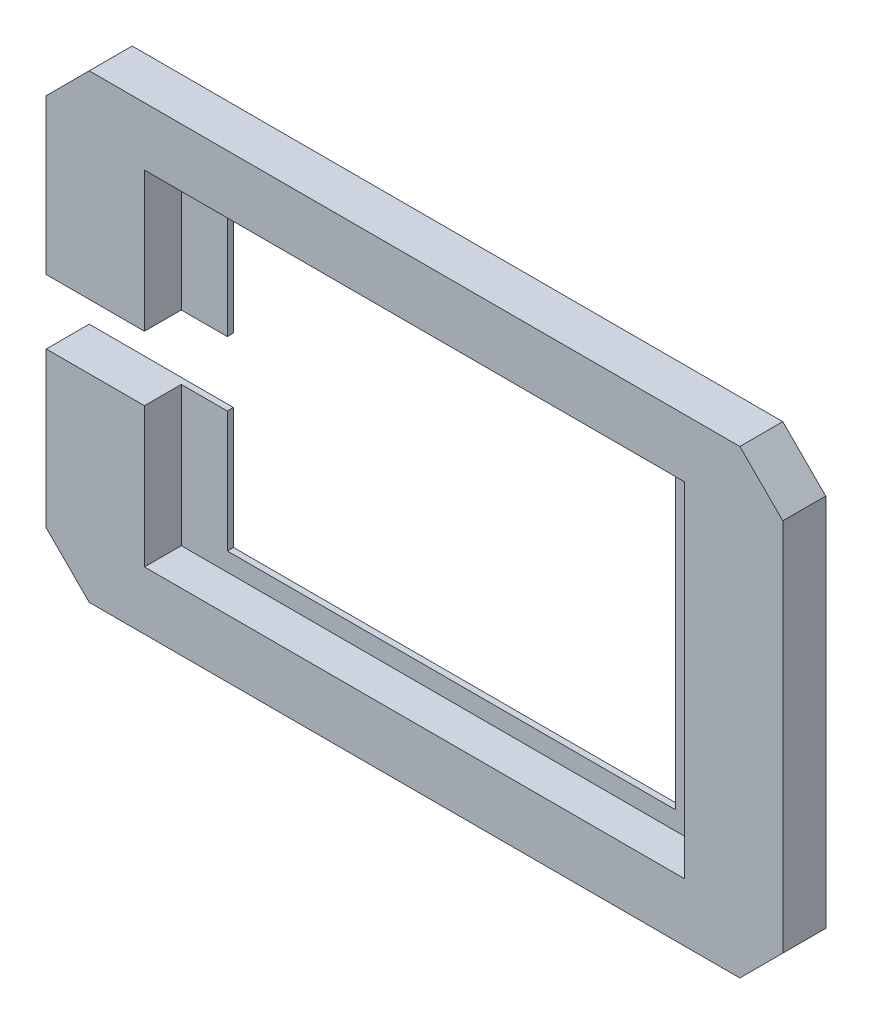
ISO-10303-21;
HEADER;
FILE_DESCRIPTION(('STEP AP214'),'2;1');
FILE_NAME('part.step','',(''),(''),'','','');
FILE_SCHEMA(('AUTOMOTIVE_DESIGN { 1 0 10303 214 1 1 1 1 }'));
ENDSEC;
DATA;
#1=APPLICATION_CONTEXT('core data for automotive mechanical design processes');
#2=APPLICATION_PROTOCOL_DEFINITION('international standard','automotive_design',2000,#1);
#3=PRODUCT_CONTEXT('',#1,'mechanical');
#4=PRODUCT('Part','Part','',(#3));
#5=PRODUCT_RELATED_PRODUCT_CATEGORY('part','',(#4));
#6=PRODUCT_DEFINITION_FORMATION('','',#4);
#7=PRODUCT_DEFINITION_CONTEXT('part definition',#1,'design');
#8=PRODUCT_DEFINITION('design','',#6,#7);
#9=PRODUCT_DEFINITION_SHAPE('','',#8);
#10=(LENGTH_UNIT() NAMED_UNIT(*) SI_UNIT(.MILLI.,.METRE.));
#11=(NAMED_UNIT(*) PLANE_ANGLE_UNIT() SI_UNIT($,.RADIAN.));
#12=(NAMED_UNIT(*) SI_UNIT($,.STERADIAN.) SOLID_ANGLE_UNIT());
#13=UNCERTAINTY_MEASURE_WITH_UNIT(LENGTH_MEASURE(1.E-05),#10,'distance_accuracy_value','');
#14=(GEOMETRIC_REPRESENTATION_CONTEXT(3) GLOBAL_UNCERTAINTY_ASSIGNED_CONTEXT((#13)) GLOBAL_UNIT_ASSIGNED_CONTEXT((#10,
#11,#12)) REPRESENTATION_CONTEXT('',''));
#15=CARTESIAN_POINT('',(0.,0.,0.));
#16=DIRECTION('',(0.,0.,1.));
#17=DIRECTION('',(1.,0.,0.));
#18=AXIS2_PLACEMENT_3D('',#15,#16,#17);
#19=CARTESIAN_POINT('',(-36.5,-25.,15.));
#20=DIRECTION('',(-1.,0.,0.));
#21=DIRECTION('',(0.,0.,1.));
#22=AXIS2_PLACEMENT_3D('',#19,#20,#21);
#23=PLANE('',#22);
#24=DIRECTION('',(0.,1.,0.));
#25=VECTOR('',#24,1.);
#26=CARTESIAN_POINT('',(-36.5,-25.,0.));
#27=LINE('',#26,#25);
#28=CARTESIAN_POINT('',(-36.5,-25.,0.));
#29=VERTEX_POINT('',#28);
#30=CARTESIAN_POINT('',(-36.5,-5.25,0.));
#31=VERTEX_POINT('',#30);
#32=EDGE_CURVE('E270',#29,#31,#27,.T.);
#33=ORIENTED_EDGE('',*,*,#32,.T.);
#34=DIRECTION('',(0.,0.,-1.));
#35=VECTOR('',#34,1.);
#36=CARTESIAN_POINT('',(-36.5,-5.25,25.));
#37=LINE('',#36,#35);
#38=CARTESIAN_POINT('',(-36.5,-5.25,1.));
#39=VERTEX_POINT('',#38);
#40=EDGE_CURVE('E218',#39,#31,#37,.T.);
#41=ORIENTED_EDGE('',*,*,#40,.F.);
#42=DIRECTION('',(0.,1.,0.));
#43=VECTOR('',#42,1.);
#44=CARTESIAN_POINT('',(-36.5,-25.,1.));
#45=LINE('',#44,#43);
#46=CARTESIAN_POINT('',(-36.5,-25.,1.));
#47=VERTEX_POINT('',#46);
#48=EDGE_CURVE('E267',#47,#39,#45,.T.);
#49=ORIENTED_EDGE('',*,*,#48,.F.);
#50=DIRECTION('',(0.,0.,-1.));
#51=VECTOR('',#50,1.);
#52=CARTESIAN_POINT('',(-36.5,-25.,15.));
#53=LINE('',#52,#51);
#54=EDGE_CURVE('E283',#47,#29,#53,.T.);
#55=ORIENTED_EDGE('',*,*,#54,.T.);
#56=EDGE_LOOP('',(#33,#41,#49,#55));
#57=FACE_BOUND('',#56,.T.);
#58=ADVANCED_FACE('F33',(#57),#23,.F.);
#59=CARTESIAN_POINT('',(-60.,-37.5,7.));
#60=DIRECTION('',(1.,0.,0.));
#61=DIRECTION('',(0.,0.,-1.));
#62=AXIS2_PLACEMENT_3D('',#59,#60,#61);
#63=PLANE('',#62);
#64=DIRECTION('',(0.,-1.,0.));
#65=VECTOR('',#64,1.);
#66=CARTESIAN_POINT('',(-60.,-37.5,0.));
#67=LINE('',#66,#65);
#68=CARTESIAN_POINT('',(-60.,-5.25,0.));
#69=VERTEX_POINT('',#68);
#70=CARTESIAN_POINT('',(-60.,-30.5,0.));
#71=VERTEX_POINT('',#70);
#72=EDGE_CURVE('E194',#69,#71,#67,.T.);
#73=ORIENTED_EDGE('',*,*,#72,.T.);
#74=DIRECTION('',(0.,0.,1.));
#75=VECTOR('',#74,1.);
#76=CARTESIAN_POINT('',(-60.,-30.5,7.));
#77=LINE('',#76,#75);
#78=CARTESIAN_POINT('',(-60.,-30.5,7.));
#79=VERTEX_POINT('',#78);
#80=EDGE_CURVE('E330',#71,#79,#77,.T.);
#81=ORIENTED_EDGE('',*,*,#80,.T.);
#82=DIRECTION('',(0.,-1.,0.));
#83=VECTOR('',#82,1.);
#84=CARTESIAN_POINT('',(-60.,-37.5,7.));
#85=LINE('',#84,#83);
#86=CARTESIAN_POINT('',(-60.,-5.25,7.));
#87=VERTEX_POINT('',#86);
#88=EDGE_CURVE('E294',#87,#79,#85,.T.);
#89=ORIENTED_EDGE('',*,*,#88,.F.);
#90=DIRECTION('',(0.,0.,-1.));
#91=VECTOR('',#90,1.);
#92=CARTESIAN_POINT('',(-60.,-5.25,25.));
#93=LINE('',#92,#91);
#94=EDGE_CURVE('E214',#87,#69,#93,.T.);
#95=ORIENTED_EDGE('',*,*,#94,.T.);
#96=EDGE_LOOP('',(#73,#81,#89,#95));
#97=FACE_BOUND('',#96,.T.);
#98=ADVANCED_FACE('F372',(#97),#63,.F.);
#99=CARTESIAN_POINT('',(-44.,-28.,1.));
#100=DIRECTION('',(-1.,0.,0.));
#101=DIRECTION('',(0.,0.,1.));
#102=AXIS2_PLACEMENT_3D('',#99,#100,#101);
#103=PLANE('',#102);
#104=DIRECTION('',(0.,-1.,0.));
#105=VECTOR('',#104,1.);
#106=CARTESIAN_POINT('',(-44.,-28.,1.));
#107=LINE('',#106,#105);
#108=CARTESIAN_POINT('',(-44.,-5.25,1.));
#109=VERTEX_POINT('',#108);
#110=CARTESIAN_POINT('',(-44.,-28.,1.));
#111=VERTEX_POINT('',#110);
#112=EDGE_CURVE('E232',#109,#111,#107,.T.);
#113=ORIENTED_EDGE('',*,*,#112,.F.);
#114=DIRECTION('',(0.,0.,1.));
#115=VECTOR('',#114,1.);
#116=CARTESIAN_POINT('',(-44.,-5.25,1.));
#117=LINE('',#116,#115);
#118=CARTESIAN_POINT('',(-44.,-5.25000000000001,7.));
#119=VERTEX_POINT('',#118);
#120=EDGE_CURVE('E314',#109,#119,#117,.T.);
#121=ORIENTED_EDGE('',*,*,#120,.T.);
#122=DIRECTION('',(0.,-1.,0.));
#123=VECTOR('',#122,1.);
#124=CARTESIAN_POINT('',(-44.,-28.,7.));
#125=LINE('',#124,#123);
#126=CARTESIAN_POINT('',(-44.,-28.,7.));
#127=VERTEX_POINT('',#126);
#128=EDGE_CURVE('E227',#119,#127,#125,.T.);
#129=ORIENTED_EDGE('',*,*,#128,.T.);
#130=DIRECTION('',(0.,0.,1.));
#131=VECTOR('',#130,1.);
#132=CARTESIAN_POINT('',(-44.,-28.,1.));
#133=LINE('',#132,#131);
#134=EDGE_CURVE('E241',#111,#127,#133,.T.);
#135=ORIENTED_EDGE('',*,*,#134,.F.);
#136=EDGE_LOOP('',(#113,#121,#129,#135));
#137=FACE_BOUND('',#136,.T.);
#138=ADVANCED_FACE('F379',(#137),#103,.F.);
#139=CARTESIAN_POINT('',(-36.5,5.25,1.));
#140=VERTEX_POINT('',#139);
#141=CARTESIAN_POINT('',(-36.5,25.,1.));
#142=VERTEX_POINT('',#141);
#143=EDGE_CURVE('E266',#140,#142,#45,.T.);
#144=ORIENTED_EDGE('',*,*,#143,.F.);
#145=DIRECTION('',(0.,0.,-1.));
#146=VECTOR('',#145,1.);
#147=CARTESIAN_POINT('',(-36.5,5.25,25.));
#148=LINE('',#147,#146);
#149=CARTESIAN_POINT('',(-36.5,5.25,0.));
#150=VERTEX_POINT('',#149);
#151=EDGE_CURVE('E203',#140,#150,#148,.T.);
#152=ORIENTED_EDGE('',*,*,#151,.T.);
#153=CARTESIAN_POINT('',(-36.5,25.,0.));
#154=VERTEX_POINT('',#153);
#155=EDGE_CURVE('E210',#150,#154,#27,.T.);
#156=ORIENTED_EDGE('',*,*,#155,.T.);
#157=DIRECTION('',(0.,0.,-1.));
#158=VECTOR('',#157,1.);
#159=CARTESIAN_POINT('',(-36.5,25.,15.));
#160=LINE('',#159,#158);
#161=EDGE_CURVE('E282',#142,#154,#160,.T.);
#162=ORIENTED_EDGE('',*,*,#161,.F.);
#163=EDGE_LOOP('',(#144,#152,#156,#162));
#164=FACE_BOUND('',#163,.T.);
#165=ADVANCED_FACE('F375',(#164),#23,.F.);
#166=CARTESIAN_POINT('',(36.5,-25.,15.));
#167=DIRECTION('',(0.,-1.,0.));
#168=DIRECTION('',(0.,0.,-1.));
#169=AXIS2_PLACEMENT_3D('',#166,#167,#168);
#170=PLANE('',#169);
#171=DIRECTION('',(-1.,0.,0.));
#172=VECTOR('',#171,1.);
#173=CARTESIAN_POINT('',(36.5,-25.,1.));
#174=LINE('',#173,#172);
#175=CARTESIAN_POINT('',(36.5,-25.,1.));
#176=VERTEX_POINT('',#175);
#177=EDGE_CURVE('E264',#176,#47,#174,.T.);
#178=ORIENTED_EDGE('',*,*,#177,.F.);
#179=DIRECTION('',(0.,0.,-1.));
#180=VECTOR('',#179,1.);
#181=CARTESIAN_POINT('',(36.5,-25.,15.));
#182=LINE('',#181,#180);
#183=CARTESIAN_POINT('',(36.5,-25.,0.));
#184=VERTEX_POINT('',#183);
#185=EDGE_CURVE('E285',#176,#184,#182,.T.);
#186=ORIENTED_EDGE('',*,*,#185,.T.);
#187=DIRECTION('',(-1.,0.,0.));
#188=VECTOR('',#187,1.);
#189=CARTESIAN_POINT('',(36.5,-25.,0.));
#190=LINE('',#189,#188);
#191=EDGE_CURVE('E279',#184,#29,#190,.T.);
#192=ORIENTED_EDGE('',*,*,#191,.T.);
#193=ORIENTED_EDGE('',*,*,#54,.F.);
#194=EDGE_LOOP('',(#178,#186,#192,#193));
#195=FACE_BOUND('',#194,.T.);
#196=ADVANCED_FACE('F385',(#195),#170,.F.);
#197=CARTESIAN_POINT('',(36.5,-25.,15.));
#198=DIRECTION('',(1.,0.,0.));
#199=DIRECTION('',(0.,0.,-1.));
#200=AXIS2_PLACEMENT_3D('',#197,#198,#199);
#201=PLANE('',#200);
#202=DIRECTION('',(0.,-1.,0.));
#203=VECTOR('',#202,1.);
#204=CARTESIAN_POINT('',(36.5,-25.,1.));
#205=LINE('',#204,#203);
#206=CARTESIAN_POINT('',(36.5,25.,1.));
#207=VERTEX_POINT('',#206);
#208=EDGE_CURVE('E256',#207,#176,#205,.T.);
#209=ORIENTED_EDGE('',*,*,#208,.F.);
#210=DIRECTION('',(0.,0.,-1.));
#211=VECTOR('',#210,1.);
#212=CARTESIAN_POINT('',(36.5,25.,15.));
#213=LINE('',#212,#211);
#214=CARTESIAN_POINT('',(36.5,25.,0.));
#215=VERTEX_POINT('',#214);
#216=EDGE_CURVE('E287',#207,#215,#213,.T.);
#217=ORIENTED_EDGE('',*,*,#216,.T.);
#218=DIRECTION('',(0.,-1.,0.));
#219=VECTOR('',#218,1.);
#220=CARTESIAN_POINT('',(36.5,-25.,0.));
#221=LINE('',#220,#219);
#222=EDGE_CURVE('E276',#215,#184,#221,.T.);
#223=ORIENTED_EDGE('',*,*,#222,.T.);
#224=ORIENTED_EDGE('',*,*,#185,.F.);
#225=EDGE_LOOP('',(#209,#217,#223,#224));
#226=FACE_BOUND('',#225,.T.);
#227=ADVANCED_FACE('F391',(#226),#201,.F.);
#228=CARTESIAN_POINT('',(36.5,25.,15.));
#229=DIRECTION('',(0.,1.,0.));
#230=DIRECTION('',(0.,0.,1.));
#231=AXIS2_PLACEMENT_3D('',#228,#229,#230);
#232=PLANE('',#231);
#233=DIRECTION('',(1.,0.,0.));
#234=VECTOR('',#233,1.);
#235=CARTESIAN_POINT('',(36.5,25.,1.));
#236=LINE('',#235,#234);
#237=EDGE_CURVE('E301',#142,#207,#236,.T.);
#238=ORIENTED_EDGE('',*,*,#237,.F.);
#239=ORIENTED_EDGE('',*,*,#161,.T.);
#240=DIRECTION('',(1.,0.,0.));
#241=VECTOR('',#240,1.);
#242=CARTESIAN_POINT('',(36.5,25.,0.));
#243=LINE('',#242,#241);
#244=EDGE_CURVE('E273',#154,#215,#243,.T.);
#245=ORIENTED_EDGE('',*,*,#244,.T.);
#246=ORIENTED_EDGE('',*,*,#216,.F.);
#247=EDGE_LOOP('',(#238,#239,#245,#246));
#248=FACE_BOUND('',#247,.T.);
#249=ADVANCED_FACE('F407',(#248),#232,.F.);
#250=CARTESIAN_POINT('',(-60.,30.5,7.));
#251=VERTEX_POINT('',#250);
#252=CARTESIAN_POINT('',(-60.,5.25,7.));
#253=VERTEX_POINT('',#252);
#254=EDGE_CURVE('E291',#251,#253,#85,.T.);
#255=ORIENTED_EDGE('',*,*,#254,.F.);
#256=DIRECTION('',(0.,0.,-1.));
#257=VECTOR('',#256,1.);
#258=CARTESIAN_POINT('',(-60.,30.5,7.));
#259=LINE('',#258,#257);
#260=CARTESIAN_POINT('',(-60.,30.5,0.));
#261=VERTEX_POINT('',#260);
#262=EDGE_CURVE('E190',#251,#261,#259,.T.);
#263=ORIENTED_EDGE('',*,*,#262,.T.);
#264=CARTESIAN_POINT('',(-60.,5.25,0.));
#265=VERTEX_POINT('',#264);
#266=EDGE_CURVE('E185',#261,#265,#67,.T.);
#267=ORIENTED_EDGE('',*,*,#266,.T.);
#268=DIRECTION('',(0.,0.,-1.));
#269=VECTOR('',#268,1.);
#270=CARTESIAN_POINT('',(-60.,5.25,25.));
#271=LINE('',#270,#269);
#272=EDGE_CURVE('E188',#253,#265,#271,.T.);
#273=ORIENTED_EDGE('',*,*,#272,.F.);
#274=EDGE_LOOP('',(#255,#263,#267,#273));
#275=FACE_BOUND('',#274,.T.);
#276=ADVANCED_FACE('F187',(#275),#63,.F.);
#277=CARTESIAN_POINT('',(60.,-37.5,7.));
#278=DIRECTION('',(0.,1.,0.));
#279=DIRECTION('',(-1.,0.,0.));
#280=AXIS2_PLACEMENT_3D('',#277,#278,#279);
#281=PLANE('',#280);
#282=DIRECTION('',(1.,0.,0.));
#283=VECTOR('',#282,1.);
#284=CARTESIAN_POINT('',(60.,-37.5,7.));
#285=LINE('',#284,#283);
#286=CARTESIAN_POINT('',(-53.,-37.5,7.));
#287=VERTEX_POINT('',#286);
#288=CARTESIAN_POINT('',(53.,-37.5,7.));
#289=VERTEX_POINT('',#288);
#290=EDGE_CURVE('E293',#287,#289,#285,.T.);
#291=ORIENTED_EDGE('',*,*,#290,.F.);
#292=DIRECTION('',(0.,0.,-1.));
#293=VECTOR('',#292,1.);
#294=CARTESIAN_POINT('',(-53.,-37.5,7.));
#295=LINE('',#294,#293);
#296=CARTESIAN_POINT('',(-53.,-37.5,0.));
#297=VERTEX_POINT('',#296);
#298=EDGE_CURVE('E319',#287,#297,#295,.T.);
#299=ORIENTED_EDGE('',*,*,#298,.T.);
#300=DIRECTION('',(1.,0.,0.));
#301=VECTOR('',#300,1.);
#302=CARTESIAN_POINT('',(60.,-37.5,0.));
#303=LINE('',#302,#301);
#304=CARTESIAN_POINT('',(53.,-37.5,0.));
#305=VERTEX_POINT('',#304);
#306=EDGE_CURVE('E193',#297,#305,#303,.T.);
#307=ORIENTED_EDGE('',*,*,#306,.T.);
#308=DIRECTION('',(0.,0.,1.));
#309=VECTOR('',#308,1.);
#310=CARTESIAN_POINT('',(53.,-37.5,7.));
#311=LINE('',#310,#309);
#312=EDGE_CURVE('E317',#305,#289,#311,.T.);
#313=ORIENTED_EDGE('',*,*,#312,.T.);
#314=EDGE_LOOP('',(#291,#299,#307,#313));
#315=FACE_BOUND('',#314,.T.);
#316=ADVANCED_FACE('F452',(#315),#281,.F.);
#317=CARTESIAN_POINT('',(60.,-37.5,7.));
#318=DIRECTION('',(-1.,0.,0.));
#319=DIRECTION('',(0.,0.,1.));
#320=AXIS2_PLACEMENT_3D('',#317,#318,#319);
#321=PLANE('',#320);
#322=DIRECTION('',(0.,1.,0.));
#323=VECTOR('',#322,1.);
#324=CARTESIAN_POINT('',(60.,-37.5,7.));
#325=LINE('',#324,#323);
#326=CARTESIAN_POINT('',(60.,-30.5,7.));
#327=VERTEX_POINT('',#326);
#328=CARTESIAN_POINT('',(60.,30.5,7.));
#329=VERTEX_POINT('',#328);
#330=EDGE_CURVE('E297',#327,#329,#325,.T.);
#331=ORIENTED_EDGE('',*,*,#330,.F.);
#332=DIRECTION('',(0.,0.,-1.));
#333=VECTOR('',#332,1.);
#334=CARTESIAN_POINT('',(60.,-30.5,7.));
#335=LINE('',#334,#333);
#336=CARTESIAN_POINT('',(60.,-30.5,0.));
#337=VERTEX_POINT('',#336);
#338=EDGE_CURVE('E11',#327,#337,#335,.T.);
#339=ORIENTED_EDGE('',*,*,#338,.T.);
#340=DIRECTION('',(0.,1.,0.));
#341=VECTOR('',#340,1.);
#342=CARTESIAN_POINT('',(60.,-37.5,0.));
#343=LINE('',#342,#341);
#344=CARTESIAN_POINT('',(60.,30.5,0.));
#345=VERTEX_POINT('',#344);
#346=EDGE_CURVE('E305',#337,#345,#343,.T.);
#347=ORIENTED_EDGE('',*,*,#346,.T.);
#348=DIRECTION('',(0.,0.,1.));
#349=VECTOR('',#348,1.);
#350=CARTESIAN_POINT('',(60.,30.5,7.));
#351=LINE('',#350,#349);
#352=EDGE_CURVE('E41',#345,#329,#351,.T.);
#353=ORIENTED_EDGE('',*,*,#352,.T.);
#354=EDGE_LOOP('',(#331,#339,#347,#353));
#355=FACE_BOUND('',#354,.T.);
#356=ADVANCED_FACE('F346',(#355),#321,.F.);
#357=CARTESIAN_POINT('',(60.,37.5,7.));
#358=DIRECTION('',(0.,-1.,0.));
#359=DIRECTION('',(1.,0.,0.));
#360=AXIS2_PLACEMENT_3D('',#357,#358,#359);
#361=PLANE('',#360);
#362=DIRECTION('',(-1.,0.,0.));
#363=VECTOR('',#362,1.);
#364=CARTESIAN_POINT('',(60.,37.5,0.));
#365=LINE('',#364,#363);
#366=CARTESIAN_POINT('',(53.,37.5,0.));
#367=VERTEX_POINT('',#366);
#368=CARTESIAN_POINT('',(-53.,37.5,0.));
#369=VERTEX_POINT('',#368);
#370=EDGE_CURVE('E308',#367,#369,#365,.T.);
#371=ORIENTED_EDGE('',*,*,#370,.T.);
#372=DIRECTION('',(0.,0.,1.));
#373=VECTOR('',#372,1.);
#374=CARTESIAN_POINT('',(-53.,37.5,7.));
#375=LINE('',#374,#373);
#376=CARTESIAN_POINT('',(-53.,37.5,7.));
#377=VERTEX_POINT('',#376);
#378=EDGE_CURVE('E56',#369,#377,#375,.T.);
#379=ORIENTED_EDGE('',*,*,#378,.T.);
#380=DIRECTION('',(-1.,0.,0.));
#381=VECTOR('',#380,1.);
#382=CARTESIAN_POINT('',(60.,37.5,7.));
#383=LINE('',#382,#381);
#384=CARTESIAN_POINT('',(53.,37.5,7.));
#385=VERTEX_POINT('',#384);
#386=EDGE_CURVE('E300',#385,#377,#383,.T.);
#387=ORIENTED_EDGE('',*,*,#386,.F.);
#388=DIRECTION('',(0.,0.,-1.));
#389=VECTOR('',#388,1.);
#390=CARTESIAN_POINT('',(53.,37.5,7.));
#391=LINE('',#390,#389);
#392=EDGE_CURVE('E340',#385,#367,#391,.T.);
#393=ORIENTED_EDGE('',*,*,#392,.T.);
#394=EDGE_LOOP('',(#371,#379,#387,#393));
#395=FACE_BOUND('',#394,.T.);
#396=ADVANCED_FACE('F356',(#395),#361,.F.);
#397=CARTESIAN_POINT('',(0.,0.,7.));
#398=DIRECTION('',(0.,0.,1.));
#399=DIRECTION('',(1.,0.,0.));
#400=AXIS2_PLACEMENT_3D('',#397,#398,#399);
#401=PLANE('',#400);
#402=ORIENTED_EDGE('',*,*,#88,.T.);
#403=DIRECTION('',(-0.707106781186546,0.707106781186549,0.));
#404=VECTOR('',#403,1.);
#405=CARTESIAN_POINT('',(-45.2500000000001,-45.2499999999999,7.));
#406=LINE('',#405,#404);
#407=EDGE_CURVE('E337',#79,#287,#406,.F.);
#408=ORIENTED_EDGE('',*,*,#407,.T.);
#409=ORIENTED_EDGE('',*,*,#290,.T.);
#410=DIRECTION('',(-0.707106781186549,-0.707106781186546,0.));
#411=VECTOR('',#410,1.);
#412=CARTESIAN_POINT('',(45.2499999999999,-45.2500000000001,7.));
#413=LINE('',#412,#411);
#414=EDGE_CURVE('E334',#289,#327,#413,.F.);
#415=ORIENTED_EDGE('',*,*,#414,.T.);
#416=ORIENTED_EDGE('',*,*,#330,.T.);
#417=DIRECTION('',(0.707106781186546,-0.707106781186549,0.));
#418=VECTOR('',#417,1.);
#419=CARTESIAN_POINT('',(45.2500000000001,45.2499999999999,7.));
#420=LINE('',#419,#418);
#421=EDGE_CURVE('E332',#329,#385,#420,.F.);
#422=ORIENTED_EDGE('',*,*,#421,.T.);
#423=ORIENTED_EDGE('',*,*,#386,.T.);
#424=DIRECTION('',(0.707106781186549,0.707106781186546,0.));
#425=VECTOR('',#424,1.);
#426=CARTESIAN_POINT('',(-45.2499999999999,45.2500000000001,7.));
#427=LINE('',#426,#425);
#428=EDGE_CURVE('E48',#377,#251,#427,.F.);
#429=ORIENTED_EDGE('',*,*,#428,.T.);
#430=ORIENTED_EDGE('',*,*,#254,.T.);
#431=DIRECTION('',(-1.,0.,0.));
#432=VECTOR('',#431,1.);
#433=CARTESIAN_POINT('',(0.,5.25,7.));
#434=LINE('',#433,#432);
#435=CARTESIAN_POINT('',(-44.,5.25,7.));
#436=VERTEX_POINT('',#435);
#437=EDGE_CURVE('E202',#436,#253,#434,.T.);
#438=ORIENTED_EDGE('',*,*,#437,.F.);
#439=CARTESIAN_POINT('',(-44.,28.,7.));
#440=VERTEX_POINT('',#439);
#441=EDGE_CURVE('E242',#440,#436,#125,.T.);
#442=ORIENTED_EDGE('',*,*,#441,.F.);
#443=DIRECTION('',(-1.,0.,0.));
#444=VECTOR('',#443,1.);
#445=CARTESIAN_POINT('',(44.,28.,7.));
#446=LINE('',#445,#444);
#447=CARTESIAN_POINT('',(44.,28.,7.));
#448=VERTEX_POINT('',#447);
#449=EDGE_CURVE('E251',#448,#440,#446,.T.);
#450=ORIENTED_EDGE('',*,*,#449,.F.);
#451=DIRECTION('',(0.,1.,0.));
#452=VECTOR('',#451,1.);
#453=CARTESIAN_POINT('',(44.,-28.,7.));
#454=LINE('',#453,#452);
#455=CARTESIAN_POINT('',(44.,-28.,7.));
#456=VERTEX_POINT('',#455);
#457=EDGE_CURVE('E248',#456,#448,#454,.T.);
#458=ORIENTED_EDGE('',*,*,#457,.F.);
#459=DIRECTION('',(1.,0.,0.));
#460=VECTOR('',#459,1.);
#461=CARTESIAN_POINT('',(44.,-28.,7.));
#462=LINE('',#461,#460);
#463=EDGE_CURVE('E245',#127,#456,#462,.T.);
#464=ORIENTED_EDGE('',*,*,#463,.F.);
#465=ORIENTED_EDGE('',*,*,#128,.F.);
#466=DIRECTION('',(1.,0.,0.));
#467=VECTOR('',#466,1.);
#468=CARTESIAN_POINT('',(0.,-5.25000000000001,7.));
#469=LINE('',#468,#467);
#470=EDGE_CURVE('E225',#87,#119,#469,.T.);
#471=ORIENTED_EDGE('',*,*,#470,.F.);
#472=EDGE_LOOP('',(#402,#408,#409,#415,#416,#422,#423,#429,#430,#438,#442,#450,#458,#464,#465,#471));
#473=FACE_BOUND('',#472,.T.);
#474=ADVANCED_FACE('F352',(#473),#401,.T.);
#475=CARTESIAN_POINT('',(0.,0.,0.));
#476=DIRECTION('',(0.,0.,1.));
#477=DIRECTION('',(1.,0.,0.));
#478=AXIS2_PLACEMENT_3D('',#475,#476,#477);
#479=PLANE('',#478);
#480=ORIENTED_EDGE('',*,*,#306,.F.);
#481=DIRECTION('',(0.707106781186546,-0.707106781186549,0.));
#482=VECTOR('',#481,1.);
#483=CARTESIAN_POINT('',(-53.,-37.5,0.));
#484=LINE('',#483,#482);
#485=EDGE_CURVE('E328',#297,#71,#484,.F.);
#486=ORIENTED_EDGE('',*,*,#485,.T.);
#487=ORIENTED_EDGE('',*,*,#72,.F.);
#488=DIRECTION('',(-1.,0.,0.));
#489=VECTOR('',#488,1.);
#490=CARTESIAN_POINT('',(-60.,-5.25,0.));
#491=LINE('',#490,#489);
#492=EDGE_CURVE('E204',#31,#69,#491,.T.);
#493=ORIENTED_EDGE('',*,*,#492,.F.);
#494=ORIENTED_EDGE('',*,*,#32,.F.);
#495=ORIENTED_EDGE('',*,*,#191,.F.);
#496=ORIENTED_EDGE('',*,*,#222,.F.);
#497=ORIENTED_EDGE('',*,*,#244,.F.);
#498=ORIENTED_EDGE('',*,*,#155,.F.);
#499=DIRECTION('',(1.,0.,0.));
#500=VECTOR('',#499,1.);
#501=CARTESIAN_POINT('',(-36.5,5.25,0.));
#502=LINE('',#501,#500);
#503=EDGE_CURVE('E199',#265,#150,#502,.T.);
#504=ORIENTED_EDGE('',*,*,#503,.F.);
#505=ORIENTED_EDGE('',*,*,#266,.F.);
#506=DIRECTION('',(-0.707106781186549,-0.707106781186546,0.));
#507=VECTOR('',#506,1.);
#508=CARTESIAN_POINT('',(-60.,30.5,0.));
#509=LINE('',#508,#507);
#510=EDGE_CURVE('E326',#261,#369,#509,.F.);
#511=ORIENTED_EDGE('',*,*,#510,.T.);
#512=ORIENTED_EDGE('',*,*,#370,.F.);
#513=DIRECTION('',(-0.707106781186546,0.707106781186549,0.));
#514=VECTOR('',#513,1.);
#515=CARTESIAN_POINT('',(53.,37.5,0.));
#516=LINE('',#515,#514);
#517=EDGE_CURVE('E322',#367,#345,#516,.F.);
#518=ORIENTED_EDGE('',*,*,#517,.T.);
#519=ORIENTED_EDGE('',*,*,#346,.F.);
#520=DIRECTION('',(0.707106781186549,0.707106781186546,0.));
#521=VECTOR('',#520,1.);
#522=CARTESIAN_POINT('',(60.,-30.5,0.));
#523=LINE('',#522,#521);
#524=EDGE_CURVE('E324',#337,#305,#523,.F.);
#525=ORIENTED_EDGE('',*,*,#524,.T.);
#526=EDGE_LOOP('',(#480,#486,#487,#493,#494,#495,#496,#497,#498,#504,#505,#511,#512,#518,#519,#525));
#527=FACE_BOUND('',#526,.T.);
#528=ADVANCED_FACE('F208',(#527),#479,.F.);
#529=CARTESIAN_POINT('',(0.,0.,1.));
#530=DIRECTION('',(0.,0.,1.));
#531=DIRECTION('',(1.,0.,0.));
#532=AXIS2_PLACEMENT_3D('',#529,#530,#531);
#533=PLANE('',#532);
#534=DIRECTION('',(1.,0.,0.));
#535=VECTOR('',#534,1.);
#536=CARTESIAN_POINT('',(0.,-5.25000000000001,1.));
#537=LINE('',#536,#535);
#538=EDGE_CURVE('E223',#109,#39,#537,.T.);
#539=ORIENTED_EDGE('',*,*,#538,.F.);
#540=ORIENTED_EDGE('',*,*,#112,.T.);
#541=DIRECTION('',(1.,0.,0.));
#542=VECTOR('',#541,1.);
#543=CARTESIAN_POINT('',(44.,-28.,1.));
#544=LINE('',#543,#542);
#545=CARTESIAN_POINT('',(44.,-28.,1.));
#546=VERTEX_POINT('',#545);
#547=EDGE_CURVE('E231',#111,#546,#544,.T.);
#548=ORIENTED_EDGE('',*,*,#547,.T.);
#549=DIRECTION('',(0.,1.,0.));
#550=VECTOR('',#549,1.);
#551=CARTESIAN_POINT('',(44.,-28.,1.));
#552=LINE('',#551,#550);
#553=CARTESIAN_POINT('',(44.,28.,1.));
#554=VERTEX_POINT('',#553);
#555=EDGE_CURVE('E235',#546,#554,#552,.T.);
#556=ORIENTED_EDGE('',*,*,#555,.T.);
#557=DIRECTION('',(-1.,0.,0.));
#558=VECTOR('',#557,1.);
#559=CARTESIAN_POINT('',(44.,28.,1.));
#560=LINE('',#559,#558);
#561=CARTESIAN_POINT('',(-44.,28.,1.));
#562=VERTEX_POINT('',#561);
#563=EDGE_CURVE('E238',#554,#562,#560,.T.);
#564=ORIENTED_EDGE('',*,*,#563,.T.);
#565=CARTESIAN_POINT('',(-44.,5.24999999999999,1.));
#566=VERTEX_POINT('',#565);
#567=EDGE_CURVE('E228',#562,#566,#107,.T.);
#568=ORIENTED_EDGE('',*,*,#567,.T.);
#569=DIRECTION('',(-1.,0.,0.));
#570=VECTOR('',#569,1.);
#571=CARTESIAN_POINT('',(0.,5.25,1.));
#572=LINE('',#571,#570);
#573=EDGE_CURVE('E217',#140,#566,#572,.T.);
#574=ORIENTED_EDGE('',*,*,#573,.F.);
#575=ORIENTED_EDGE('',*,*,#143,.T.);
#576=ORIENTED_EDGE('',*,*,#237,.T.);
#577=ORIENTED_EDGE('',*,*,#208,.T.);
#578=ORIENTED_EDGE('',*,*,#177,.T.);
#579=ORIENTED_EDGE('',*,*,#48,.T.);
#580=EDGE_LOOP('',(#539,#540,#548,#556,#564,#568,#574,#575,#576,#577,#578,#579));
#581=FACE_BOUND('',#580,.T.);
#582=ADVANCED_FACE('F403',(#581),#533,.T.);
#583=ORIENTED_EDGE('',*,*,#441,.T.);
#584=DIRECTION('',(0.,0.,-1.));
#585=VECTOR('',#584,1.);
#586=CARTESIAN_POINT('',(-44.,5.25,1.));
#587=LINE('',#586,#585);
#588=EDGE_CURVE('E311',#436,#566,#587,.T.);
#589=ORIENTED_EDGE('',*,*,#588,.T.);
#590=ORIENTED_EDGE('',*,*,#567,.F.);
#591=DIRECTION('',(0.,0.,1.));
#592=VECTOR('',#591,1.);
#593=CARTESIAN_POINT('',(-44.,28.,1.));
#594=LINE('',#593,#592);
#595=EDGE_CURVE('E254',#562,#440,#594,.T.);
#596=ORIENTED_EDGE('',*,*,#595,.T.);
#597=EDGE_LOOP('',(#583,#589,#590,#596));
#598=FACE_BOUND('',#597,.T.);
#599=ADVANCED_FACE('F396',(#598),#103,.F.);
#600=CARTESIAN_POINT('',(44.,28.,1.));
#601=DIRECTION('',(0.,1.,0.));
#602=DIRECTION('',(-1.,0.,0.));
#603=AXIS2_PLACEMENT_3D('',#600,#601,#602);
#604=PLANE('',#603);
#605=ORIENTED_EDGE('',*,*,#449,.T.);
#606=ORIENTED_EDGE('',*,*,#595,.F.);
#607=ORIENTED_EDGE('',*,*,#563,.F.);
#608=DIRECTION('',(0.,0.,1.));
#609=VECTOR('',#608,1.);
#610=CARTESIAN_POINT('',(44.,28.,1.));
#611=LINE('',#610,#609);
#612=EDGE_CURVE('E257',#554,#448,#611,.T.);
#613=ORIENTED_EDGE('',*,*,#612,.T.);
#614=EDGE_LOOP('',(#605,#606,#607,#613));
#615=FACE_BOUND('',#614,.T.);
#616=ADVANCED_FACE('F429',(#615),#604,.F.);
#617=CARTESIAN_POINT('',(44.,-28.,1.));
#618=DIRECTION('',(1.,0.,0.));
#619=DIRECTION('',(0.,0.,-1.));
#620=AXIS2_PLACEMENT_3D('',#617,#618,#619);
#621=PLANE('',#620);
#622=ORIENTED_EDGE('',*,*,#457,.T.);
#623=ORIENTED_EDGE('',*,*,#612,.F.);
#624=ORIENTED_EDGE('',*,*,#555,.F.);
#625=DIRECTION('',(0.,0.,1.));
#626=VECTOR('',#625,1.);
#627=CARTESIAN_POINT('',(44.,-28.,1.));
#628=LINE('',#627,#626);
#629=EDGE_CURVE('E259',#546,#456,#628,.T.);
#630=ORIENTED_EDGE('',*,*,#629,.T.);
#631=EDGE_LOOP('',(#622,#623,#624,#630));
#632=FACE_BOUND('',#631,.T.);
#633=ADVANCED_FACE('F435',(#632),#621,.F.);
#634=CARTESIAN_POINT('',(44.,-28.,1.));
#635=DIRECTION('',(0.,-1.,0.));
#636=DIRECTION('',(1.,0.,0.));
#637=AXIS2_PLACEMENT_3D('',#634,#635,#636);
#638=PLANE('',#637);
#639=ORIENTED_EDGE('',*,*,#463,.T.);
#640=ORIENTED_EDGE('',*,*,#629,.F.);
#641=ORIENTED_EDGE('',*,*,#547,.F.);
#642=ORIENTED_EDGE('',*,*,#134,.T.);
#643=EDGE_LOOP('',(#639,#640,#641,#642));
#644=FACE_BOUND('',#643,.T.);
#645=ADVANCED_FACE('F424',(#644),#638,.F.);
#646=CARTESIAN_POINT('',(-36.5,5.25,25.));
#647=DIRECTION('',(0.,1.,0.));
#648=DIRECTION('',(0.,0.,1.));
#649=AXIS2_PLACEMENT_3D('',#646,#647,#648);
#650=PLANE('',#649);
#651=ORIENTED_EDGE('',*,*,#437,.T.);
#652=ORIENTED_EDGE('',*,*,#272,.T.);
#653=ORIENTED_EDGE('',*,*,#503,.T.);
#654=ORIENTED_EDGE('',*,*,#151,.F.);
#655=ORIENTED_EDGE('',*,*,#573,.T.);
#656=ORIENTED_EDGE('',*,*,#588,.F.);
#657=EDGE_LOOP('',(#651,#652,#653,#654,#655,#656));
#658=FACE_BOUND('',#657,.T.);
#659=ADVANCED_FACE('F198',(#658),#650,.F.);
#660=CARTESIAN_POINT('',(-60.,-5.25,25.));
#661=DIRECTION('',(0.,-1.,0.));
#662=DIRECTION('',(1.,0.,0.));
#663=AXIS2_PLACEMENT_3D('',#660,#661,#662);
#664=PLANE('',#663);
#665=ORIENTED_EDGE('',*,*,#470,.T.);
#666=ORIENTED_EDGE('',*,*,#120,.F.);
#667=ORIENTED_EDGE('',*,*,#538,.T.);
#668=ORIENTED_EDGE('',*,*,#40,.T.);
#669=ORIENTED_EDGE('',*,*,#492,.T.);
#670=ORIENTED_EDGE('',*,*,#94,.F.);
#671=EDGE_LOOP('',(#665,#666,#667,#668,#669,#670));
#672=FACE_BOUND('',#671,.T.);
#673=ADVANCED_FACE('F368',(#672),#664,.F.);
#674=CARTESIAN_POINT('',(-53.,-37.5,7.));
#675=DIRECTION('',(0.707106781186549,0.707106781186546,0.));
#676=DIRECTION('',(0.,0.,-1.));
#677=AXIS2_PLACEMENT_3D('',#674,#675,#676);
#678=PLANE('',#677);
#679=ORIENTED_EDGE('',*,*,#407,.F.);
#680=ORIENTED_EDGE('',*,*,#80,.F.);
#681=ORIENTED_EDGE('',*,*,#485,.F.);
#682=ORIENTED_EDGE('',*,*,#298,.F.);
#683=EDGE_LOOP('',(#679,#680,#681,#682));
#684=FACE_BOUND('',#683,.T.);
#685=ADVANCED_FACE('F361',(#684),#678,.F.);
#686=CARTESIAN_POINT('',(-60.,30.5,7.));
#687=DIRECTION('',(0.707106781186546,-0.707106781186549,0.));
#688=DIRECTION('',(0.,0.,-1.));
#689=AXIS2_PLACEMENT_3D('',#686,#687,#688);
#690=PLANE('',#689);
#691=ORIENTED_EDGE('',*,*,#428,.F.);
#692=ORIENTED_EDGE('',*,*,#378,.F.);
#693=ORIENTED_EDGE('',*,*,#510,.F.);
#694=ORIENTED_EDGE('',*,*,#262,.F.);
#695=EDGE_LOOP('',(#691,#692,#693,#694));
#696=FACE_BOUND('',#695,.T.);
#697=ADVANCED_FACE('F358',(#696),#690,.F.);
#698=CARTESIAN_POINT('',(60.,-30.5,7.));
#699=DIRECTION('',(-0.707106781186546,0.707106781186549,0.));
#700=DIRECTION('',(0.,0.,-1.));
#701=AXIS2_PLACEMENT_3D('',#698,#699,#700);
#702=PLANE('',#701);
#703=ORIENTED_EDGE('',*,*,#414,.F.);
#704=ORIENTED_EDGE('',*,*,#312,.F.);
#705=ORIENTED_EDGE('',*,*,#524,.F.);
#706=ORIENTED_EDGE('',*,*,#338,.F.);
#707=EDGE_LOOP('',(#703,#704,#705,#706));
#708=FACE_BOUND('',#707,.T.);
#709=ADVANCED_FACE('F360',(#708),#702,.F.);
#710=CARTESIAN_POINT('',(53.,37.5,7.));
#711=DIRECTION('',(-0.707106781186549,-0.707106781186546,0.));
#712=DIRECTION('',(0.,0.,-1.));
#713=AXIS2_PLACEMENT_3D('',#710,#711,#712);
#714=PLANE('',#713);
#715=ORIENTED_EDGE('',*,*,#421,.F.);
#716=ORIENTED_EDGE('',*,*,#352,.F.);
#717=ORIENTED_EDGE('',*,*,#517,.F.);
#718=ORIENTED_EDGE('',*,*,#392,.F.);
#719=EDGE_LOOP('',(#715,#716,#717,#718));
#720=FACE_BOUND('',#719,.T.);
#721=ADVANCED_FACE('F35',(#720),#714,.F.);
#722=CLOSED_SHELL('',(#58,#98,#138,#165,#196,#227,#249,#276,#316,#356,#396,#474,#528,#582,#599,
#616,#633,#645,#659,#673,#685,#697,#709,#721));
#723=MANIFOLD_SOLID_BREP('B2',#722);
#724=ADVANCED_BREP_SHAPE_REPRESENTATION('',(#18,#723),#14);
#725=SHAPE_DEFINITION_REPRESENTATION(#9,#724);
ENDSEC;
END-ISO-10303-21;
